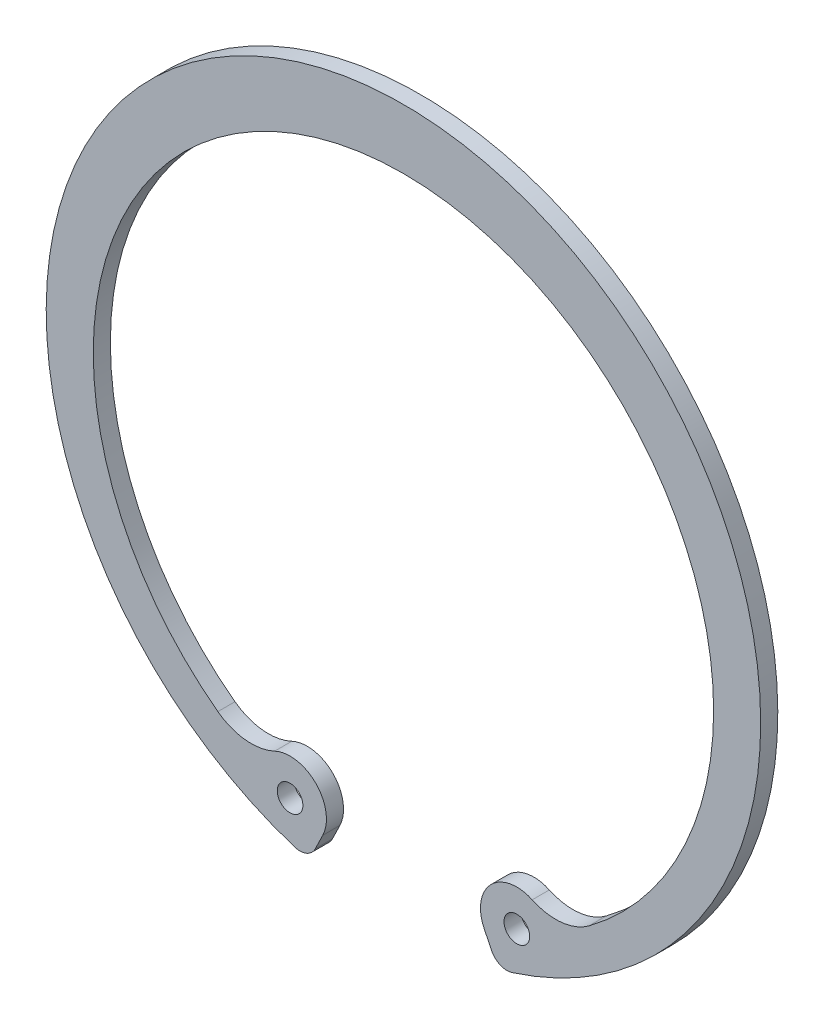
ISO-10303-21;
HEADER;
FILE_DESCRIPTION(('STEP AP214'),'2;1');
FILE_NAME('part.step','',(''),(''),'','','');
FILE_SCHEMA(('AUTOMOTIVE_DESIGN { 1 0 10303 214 1 1 1 1 }'));
ENDSEC;
DATA;
#1=APPLICATION_CONTEXT('core data for automotive mechanical design processes');
#2=APPLICATION_PROTOCOL_DEFINITION('international standard','automotive_design',2000,#1);
#3=PRODUCT_CONTEXT('',#1,'mechanical');
#4=PRODUCT('Part','Part','',(#3));
#5=PRODUCT_RELATED_PRODUCT_CATEGORY('part','',(#4));
#6=PRODUCT_DEFINITION_FORMATION('','',#4);
#7=PRODUCT_DEFINITION_CONTEXT('part definition',#1,'design');
#8=PRODUCT_DEFINITION('design','',#6,#7);
#9=PRODUCT_DEFINITION_SHAPE('','',#8);
#10=(LENGTH_UNIT() NAMED_UNIT(*) SI_UNIT(.MILLI.,.METRE.));
#11=(NAMED_UNIT(*) PLANE_ANGLE_UNIT() SI_UNIT($,.RADIAN.));
#12=(NAMED_UNIT(*) SI_UNIT($,.STERADIAN.) SOLID_ANGLE_UNIT());
#13=UNCERTAINTY_MEASURE_WITH_UNIT(LENGTH_MEASURE(1.E-05),#10,'distance_accuracy_value','');
#14=(GEOMETRIC_REPRESENTATION_CONTEXT(3) GLOBAL_UNCERTAINTY_ASSIGNED_CONTEXT((#13)) GLOBAL_UNIT_ASSIGNED_CONTEXT((#10,
#11,#12)) REPRESENTATION_CONTEXT('',''));
#15=CARTESIAN_POINT('',(0.,0.,0.));
#16=DIRECTION('',(0.,0.,1.));
#17=DIRECTION('',(1.,0.,0.));
#18=AXIS2_PLACEMENT_3D('',#15,#16,#17);
#19=CARTESIAN_POINT('',(-12.1004945718418,-37.8634458431457,2.));
#20=DIRECTION('',(0.,0.,1.));
#21=DIRECTION('',(1.,0.,0.));
#22=AXIS2_PLACEMENT_3D('',#19,#20,#21);
#23=PLANE('',#22);
#24=CARTESIAN_POINT('',(-13.25,-35.0811559102604,2.));
#25=DIRECTION('',(0.,0.,1.));
#26=DIRECTION('',(1.,0.,0.));
#27=AXIS2_PLACEMENT_3D('',#24,#25,#26);
#28=CIRCLE('',#27,1.5);
#29=CARTESIAN_POINT('',(-11.75,-35.0811559102604,2.));
#30=VERTEX_POINT('',#29);
#31=EDGE_CURVE('E167',#30,#30,#28,.T.);
#32=ORIENTED_EDGE('',*,*,#31,.F.);
#33=EDGE_LOOP('',(#32));
#34=FACE_BOUND('',#33,.T.);
#35=CARTESIAN_POINT('',(-12.1004945718418,-37.8634458431457,2.));
#36=DIRECTION('',(0.,0.,1.));
#37=DIRECTION('',(1.,0.,0.));
#38=AXIS2_PLACEMENT_3D('',#35,#36,#37);
#39=CIRCLE('',#38,2.);
#40=CARTESIAN_POINT('',(-12.7093244874062,-39.7685248792788,2.));
#41=VERTEX_POINT('',#40);
#42=CARTESIAN_POINT('',(-10.3016604578276,-38.7376287932534,2.));
#43=VERTEX_POINT('',#42);
#44=EDGE_CURVE('E191',#41,#43,#39,.T.);
#45=ORIENTED_EDGE('',*,*,#44,.T.);
#46=DIRECTION('',(0.437091475053842,0.899417057007069,0.));
#47=VECTOR('',#46,1.);
#48=CARTESIAN_POINT('',(-10.3016604578276,-38.7376287932534,2.));
#49=LINE('',#48,#47);
#50=CARTESIAN_POINT('',(-9.42747750771995,-36.9387946792392,2.));
#51=VERTEX_POINT('',#50);
#52=EDGE_CURVE('E114',#43,#51,#49,.T.);
#53=ORIENTED_EDGE('',*,*,#52,.T.);
#54=CARTESIAN_POINT('',(-13.25,-35.0811559102604,2.));
#55=DIRECTION('',(0.,0.,1.));
#56=DIRECTION('',(-1.,0.,0.));
#57=AXIS2_PLACEMENT_3D('',#54,#55,#56);
#58=CIRCLE('',#57,4.25);
#59=CARTESIAN_POINT('',(-15.0474924130677,-31.2299845267767,2.));
#60=VERTEX_POINT('',#59);
#61=EDGE_CURVE('E221',#51,#60,#58,.T.);
#62=ORIENTED_EDGE('',*,*,#61,.T.);
#63=CARTESIAN_POINT('',(-17.7965984565831,-25.3399577049781,2.));
#64=DIRECTION('',(0.,0.,-1.));
#65=DIRECTION('',(-1.,0.,0.));
#66=AXIS2_PLACEMENT_3D('',#63,#64,#65);
#67=CIRCLE('',#66,6.5);
#68=CARTESIAN_POINT('',(-21.6849308924752,-30.5486879598472,2.));
#69=VERTEX_POINT('',#68);
#70=EDGE_CURVE('E241',#60,#69,#67,.T.);
#71=ORIENTED_EDGE('',*,*,#70,.T.);
#72=CARTESIAN_POINT('',(0.,-1.49999999999999,2.));
#73=DIRECTION('',(0.,0.,-1.));
#74=DIRECTION('',(1.,0.,0.));
#75=AXIS2_PLACEMENT_3D('',#72,#73,#74);
#76=CIRCLE('',#75,36.25);
#77=CARTESIAN_POINT('',(21.6849308924752,-30.5486879598472,2.));
#78=VERTEX_POINT('',#77);
#79=EDGE_CURVE('E237',#69,#78,#76,.T.);
#80=ORIENTED_EDGE('',*,*,#79,.T.);
#81=CARTESIAN_POINT('',(17.7965984565831,-25.3399577049781,2.));
#82=DIRECTION('',(0.,0.,-1.));
#83=DIRECTION('',(1.,0.,0.));
#84=AXIS2_PLACEMENT_3D('',#81,#82,#83);
#85=CIRCLE('',#84,6.5);
#86=CARTESIAN_POINT('',(15.0474924130677,-31.2299845267767,2.));
#87=VERTEX_POINT('',#86);
#88=EDGE_CURVE('E240',#78,#87,#85,.T.);
#89=ORIENTED_EDGE('',*,*,#88,.T.);
#90=CARTESIAN_POINT('',(13.25,-35.0811559102604,2.));
#91=DIRECTION('',(0.,0.,1.));
#92=DIRECTION('',(1.,0.,0.));
#93=AXIS2_PLACEMENT_3D('',#90,#91,#92);
#94=CIRCLE('',#93,4.25);
#95=CARTESIAN_POINT('',(9.42747750771996,-36.9387946792392,2.));
#96=VERTEX_POINT('',#95);
#97=EDGE_CURVE('E139',#87,#96,#94,.T.);
#98=ORIENTED_EDGE('',*,*,#97,.T.);
#99=DIRECTION('',(0.437091475053842,-0.899417057007069,0.));
#100=VECTOR('',#99,1.);
#101=CARTESIAN_POINT('',(10.3016604578276,-38.7376287932534,2.));
#102=LINE('',#101,#100);
#103=CARTESIAN_POINT('',(10.3016604578276,-38.7376287932534,2.));
#104=VERTEX_POINT('',#103);
#105=EDGE_CURVE('E133',#96,#104,#102,.T.);
#106=ORIENTED_EDGE('',*,*,#105,.T.);
#107=CARTESIAN_POINT('',(12.1004945718418,-37.8634458431457,2.));
#108=DIRECTION('',(0.,0.,1.));
#109=DIRECTION('',(-1.,0.,0.));
#110=AXIS2_PLACEMENT_3D('',#107,#108,#109);
#111=CIRCLE('',#110,2.);
#112=CARTESIAN_POINT('',(12.7093244874062,-39.7685248792788,2.));
#113=VERTEX_POINT('',#112);
#114=EDGE_CURVE('E137',#104,#113,#111,.T.);
#115=ORIENTED_EDGE('',*,*,#114,.T.);
#116=CARTESIAN_POINT('',(0.,0.,2.));
#117=DIRECTION('',(0.,0.,1.));
#118=DIRECTION('',(1.,0.,0.));
#119=AXIS2_PLACEMENT_3D('',#116,#117,#118);
#120=CIRCLE('',#119,41.75);
#121=EDGE_CURVE('E65',#113,#41,#120,.T.);
#122=ORIENTED_EDGE('',*,*,#121,.T.);
#123=EDGE_LOOP('',(#45,#53,#62,#71,#80,#89,#98,#106,#115,#122));
#124=FACE_BOUND('',#123,.T.);
#125=CARTESIAN_POINT('',(13.25,-35.0811559102604,2.));
#126=DIRECTION('',(0.,0.,1.));
#127=DIRECTION('',(-1.,0.,0.));
#128=AXIS2_PLACEMENT_3D('',#125,#126,#127);
#129=CIRCLE('',#128,1.5);
#130=CARTESIAN_POINT('',(11.75,-35.0811559102604,2.));
#131=VERTEX_POINT('',#130);
#132=EDGE_CURVE('E263',#131,#131,#129,.T.);
#133=ORIENTED_EDGE('',*,*,#132,.F.);
#134=EDGE_LOOP('',(#133));
#135=FACE_BOUND('',#134,.T.);
#136=ADVANCED_FACE('F47',(#34,#124,#135),#23,.T.);
#137=CARTESIAN_POINT('',(-12.1004945718418,-37.8634458431457,0.));
#138=DIRECTION('',(0.,0.,1.));
#139=DIRECTION('',(1.,0.,0.));
#140=AXIS2_PLACEMENT_3D('',#137,#138,#139);
#141=PLANE('',#140);
#142=CARTESIAN_POINT('',(-12.1004945718418,-37.8634458431457,0.));
#143=DIRECTION('',(0.,0.,1.));
#144=DIRECTION('',(1.,0.,0.));
#145=AXIS2_PLACEMENT_3D('',#142,#143,#144);
#146=CIRCLE('',#145,2.);
#147=CARTESIAN_POINT('',(-12.7093244874062,-39.7685248792788,0.));
#148=VERTEX_POINT('',#147);
#149=CARTESIAN_POINT('',(-10.3016604578276,-38.7376287932534,0.));
#150=VERTEX_POINT('',#149);
#151=EDGE_CURVE('E162',#148,#150,#146,.T.);
#152=ORIENTED_EDGE('',*,*,#151,.F.);
#153=CARTESIAN_POINT('',(0.,0.,0.));
#154=DIRECTION('',(0.,0.,1.));
#155=DIRECTION('',(1.,0.,0.));
#156=AXIS2_PLACEMENT_3D('',#153,#154,#155);
#157=CIRCLE('',#156,41.75);
#158=CARTESIAN_POINT('',(12.7093244874062,-39.7685248792788,0.));
#159=VERTEX_POINT('',#158);
#160=EDGE_CURVE('E106',#159,#148,#157,.T.);
#161=ORIENTED_EDGE('',*,*,#160,.F.);
#162=CARTESIAN_POINT('',(12.1004945718418,-37.8634458431457,0.));
#163=DIRECTION('',(0.,0.,1.));
#164=DIRECTION('',(-1.,0.,0.));
#165=AXIS2_PLACEMENT_3D('',#162,#163,#164);
#166=CIRCLE('',#165,2.);
#167=CARTESIAN_POINT('',(10.3016604578276,-38.7376287932534,0.));
#168=VERTEX_POINT('',#167);
#169=EDGE_CURVE('E100',#168,#159,#166,.T.);
#170=ORIENTED_EDGE('',*,*,#169,.F.);
#171=DIRECTION('',(0.437091475053842,-0.899417057007069,0.));
#172=VECTOR('',#171,1.);
#173=CARTESIAN_POINT('',(10.3016604578276,-38.7376287932534,0.));
#174=LINE('',#173,#172);
#175=CARTESIAN_POINT('',(9.42747750771996,-36.9387946792392,0.));
#176=VERTEX_POINT('',#175);
#177=EDGE_CURVE('E148',#176,#168,#174,.T.);
#178=ORIENTED_EDGE('',*,*,#177,.F.);
#179=CARTESIAN_POINT('',(13.25,-35.0811559102604,0.));
#180=DIRECTION('',(0.,0.,1.));
#181=DIRECTION('',(1.,0.,0.));
#182=AXIS2_PLACEMENT_3D('',#179,#180,#181);
#183=CIRCLE('',#182,4.25);
#184=CARTESIAN_POINT('',(15.0474924130677,-31.2299845267767,0.));
#185=VERTEX_POINT('',#184);
#186=EDGE_CURVE('E182',#185,#176,#183,.T.);
#187=ORIENTED_EDGE('',*,*,#186,.F.);
#188=CARTESIAN_POINT('',(17.7965984565831,-25.3399577049781,0.));
#189=DIRECTION('',(0.,0.,-1.));
#190=DIRECTION('',(1.,0.,0.));
#191=AXIS2_PLACEMENT_3D('',#188,#189,#190);
#192=CIRCLE('',#191,6.5);
#193=CARTESIAN_POINT('',(21.6849308924752,-30.5486879598472,0.));
#194=VERTEX_POINT('',#193);
#195=EDGE_CURVE('E179',#194,#185,#192,.T.);
#196=ORIENTED_EDGE('',*,*,#195,.F.);
#197=CARTESIAN_POINT('',(0.,-1.49999999999999,0.));
#198=DIRECTION('',(0.,0.,-1.));
#199=DIRECTION('',(1.,0.,0.));
#200=AXIS2_PLACEMENT_3D('',#197,#198,#199);
#201=CIRCLE('',#200,36.25);
#202=CARTESIAN_POINT('',(-21.6849308924752,-30.5486879598472,0.));
#203=VERTEX_POINT('',#202);
#204=EDGE_CURVE('E176',#203,#194,#201,.T.);
#205=ORIENTED_EDGE('',*,*,#204,.F.);
#206=CARTESIAN_POINT('',(-17.7965984565831,-25.3399577049781,0.));
#207=DIRECTION('',(0.,0.,-1.));
#208=DIRECTION('',(-1.,0.,0.));
#209=AXIS2_PLACEMENT_3D('',#206,#207,#208);
#210=CIRCLE('',#209,6.5);
#211=CARTESIAN_POINT('',(-15.0474924130677,-31.2299845267767,0.));
#212=VERTEX_POINT('',#211);
#213=EDGE_CURVE('E173',#212,#203,#210,.T.);
#214=ORIENTED_EDGE('',*,*,#213,.F.);
#215=CARTESIAN_POINT('',(-13.25,-35.0811559102604,0.));
#216=DIRECTION('',(0.,0.,1.));
#217=DIRECTION('',(-1.,0.,0.));
#218=AXIS2_PLACEMENT_3D('',#215,#216,#217);
#219=CIRCLE('',#218,4.25);
#220=CARTESIAN_POINT('',(-9.42747750771995,-36.9387946792392,0.));
#221=VERTEX_POINT('',#220);
#222=EDGE_CURVE('E170',#221,#212,#219,.T.);
#223=ORIENTED_EDGE('',*,*,#222,.F.);
#224=DIRECTION('',(0.437091475053842,0.899417057007069,0.));
#225=VECTOR('',#224,1.);
#226=CARTESIAN_POINT('',(-10.3016604578276,-38.7376287932534,0.));
#227=LINE('',#226,#225);
#228=EDGE_CURVE('E166',#150,#221,#227,.T.);
#229=ORIENTED_EDGE('',*,*,#228,.F.);
#230=EDGE_LOOP('',(#152,#161,#170,#178,#187,#196,#205,#214,#223,#229));
#231=FACE_BOUND('',#230,.T.);
#232=CARTESIAN_POINT('',(-13.25,-35.0811559102604,0.));
#233=DIRECTION('',(0.,0.,1.));
#234=DIRECTION('',(1.,0.,0.));
#235=AXIS2_PLACEMENT_3D('',#232,#233,#234);
#236=CIRCLE('',#235,1.5);
#237=CARTESIAN_POINT('',(-11.75,-35.0811559102604,0.));
#238=VERTEX_POINT('',#237);
#239=EDGE_CURVE('E259',#238,#238,#236,.T.);
#240=ORIENTED_EDGE('',*,*,#239,.T.);
#241=EDGE_LOOP('',(#240));
#242=FACE_BOUND('',#241,.T.);
#243=CARTESIAN_POINT('',(13.25,-35.0811559102604,0.));
#244=DIRECTION('',(0.,0.,1.));
#245=DIRECTION('',(-1.,0.,0.));
#246=AXIS2_PLACEMENT_3D('',#243,#244,#245);
#247=CIRCLE('',#246,1.5);
#248=CARTESIAN_POINT('',(11.75,-35.0811559102604,0.));
#249=VERTEX_POINT('',#248);
#250=EDGE_CURVE('E267',#249,#249,#247,.T.);
#251=ORIENTED_EDGE('',*,*,#250,.T.);
#252=EDGE_LOOP('',(#251));
#253=FACE_BOUND('',#252,.T.);
#254=ADVANCED_FACE('F225',(#231,#242,#253),#141,.F.);
#255=CARTESIAN_POINT('',(-12.1004945718418,-37.8634458431457,2.));
#256=DIRECTION('',(0.,0.,-1.));
#257=DIRECTION('',(-1.,0.,0.));
#258=AXIS2_PLACEMENT_3D('',#255,#256,#257);
#259=CYLINDRICAL_SURFACE('',#258,2.);
#260=ORIENTED_EDGE('',*,*,#151,.T.);
#261=DIRECTION('',(0.,0.,-1.));
#262=VECTOR('',#261,1.);
#263=CARTESIAN_POINT('',(-10.3016604578276,-38.7376287932534,2.));
#264=LINE('',#263,#262);
#265=EDGE_CURVE('E11',#43,#150,#264,.T.);
#266=ORIENTED_EDGE('',*,*,#265,.F.);
#267=ORIENTED_EDGE('',*,*,#44,.F.);
#268=DIRECTION('',(0.,0.,-1.));
#269=VECTOR('',#268,1.);
#270=CARTESIAN_POINT('',(-12.7093244874062,-39.7685248792788,2.));
#271=LINE('',#270,#269);
#272=EDGE_CURVE('E158',#41,#148,#271,.T.);
#273=ORIENTED_EDGE('',*,*,#272,.T.);
#274=EDGE_LOOP('',(#260,#266,#267,#273));
#275=FACE_BOUND('',#274,.T.);
#276=ADVANCED_FACE('F49',(#275),#259,.T.);
#277=CARTESIAN_POINT('',(-10.3016604578276,-38.7376287932534,2.));
#278=DIRECTION('',(-0.899417057007069,0.437091475053842,0.));
#279=DIRECTION('',(-0.437091475053842,-0.899417057007069,0.));
#280=AXIS2_PLACEMENT_3D('',#277,#278,#279);
#281=PLANE('',#280);
#282=ORIENTED_EDGE('',*,*,#228,.T.);
#283=DIRECTION('',(0.,0.,-1.));
#284=VECTOR('',#283,1.);
#285=CARTESIAN_POINT('',(-9.42747750771995,-36.9387946792392,2.));
#286=LINE('',#285,#284);
#287=EDGE_CURVE('E57',#51,#221,#286,.T.);
#288=ORIENTED_EDGE('',*,*,#287,.F.);
#289=ORIENTED_EDGE('',*,*,#52,.F.);
#290=ORIENTED_EDGE('',*,*,#265,.T.);
#291=EDGE_LOOP('',(#282,#288,#289,#290));
#292=FACE_BOUND('',#291,.T.);
#293=ADVANCED_FACE('F310',(#292),#281,.F.);
#294=CARTESIAN_POINT('',(-13.25,-35.0811559102604,2.));
#295=DIRECTION('',(0.,0.,-1.));
#296=DIRECTION('',(-1.,0.,0.));
#297=AXIS2_PLACEMENT_3D('',#294,#295,#296);
#298=CYLINDRICAL_SURFACE('',#297,4.25);
#299=ORIENTED_EDGE('',*,*,#222,.T.);
#300=DIRECTION('',(0.,0.,-1.));
#301=VECTOR('',#300,1.);
#302=CARTESIAN_POINT('',(-15.0474924130677,-31.2299845267767,2.));
#303=LINE('',#302,#301);
#304=EDGE_CURVE('E210',#60,#212,#303,.T.);
#305=ORIENTED_EDGE('',*,*,#304,.F.);
#306=ORIENTED_EDGE('',*,*,#61,.F.);
#307=ORIENTED_EDGE('',*,*,#287,.T.);
#308=EDGE_LOOP('',(#299,#305,#306,#307));
#309=FACE_BOUND('',#308,.T.);
#310=ADVANCED_FACE('F219',(#309),#298,.T.);
#311=CARTESIAN_POINT('',(-17.7965984565831,-25.3399577049781,2.));
#312=DIRECTION('',(0.,0.,-1.));
#313=DIRECTION('',(-1.,0.,0.));
#314=AXIS2_PLACEMENT_3D('',#311,#312,#313);
#315=CYLINDRICAL_SURFACE('',#314,6.5);
#316=ORIENTED_EDGE('',*,*,#213,.T.);
#317=DIRECTION('',(0.,0.,-1.));
#318=VECTOR('',#317,1.);
#319=CARTESIAN_POINT('',(-21.6849308924752,-30.5486879598472,2.));
#320=LINE('',#319,#318);
#321=EDGE_CURVE('E206',#69,#203,#320,.T.);
#322=ORIENTED_EDGE('',*,*,#321,.F.);
#323=ORIENTED_EDGE('',*,*,#70,.F.);
#324=ORIENTED_EDGE('',*,*,#304,.T.);
#325=EDGE_LOOP('',(#316,#322,#323,#324));
#326=FACE_BOUND('',#325,.T.);
#327=ADVANCED_FACE('F231',(#326),#315,.F.);
#328=CARTESIAN_POINT('',(0.,-1.49999999999999,2.));
#329=DIRECTION('',(0.,0.,-1.));
#330=DIRECTION('',(-1.,0.,0.));
#331=AXIS2_PLACEMENT_3D('',#328,#329,#330);
#332=CYLINDRICAL_SURFACE('',#331,36.25);
#333=ORIENTED_EDGE('',*,*,#204,.T.);
#334=DIRECTION('',(0.,0.,-1.));
#335=VECTOR('',#334,1.);
#336=CARTESIAN_POINT('',(21.6849308924752,-30.5486879598472,2.));
#337=LINE('',#336,#335);
#338=EDGE_CURVE('E202',#78,#194,#337,.T.);
#339=ORIENTED_EDGE('',*,*,#338,.F.);
#340=ORIENTED_EDGE('',*,*,#79,.F.);
#341=ORIENTED_EDGE('',*,*,#321,.T.);
#342=EDGE_LOOP('',(#333,#339,#340,#341));
#343=FACE_BOUND('',#342,.T.);
#344=ADVANCED_FACE('F235',(#343),#332,.F.);
#345=CARTESIAN_POINT('',(17.7965984565831,-25.3399577049781,2.));
#346=DIRECTION('',(0.,0.,-1.));
#347=DIRECTION('',(-1.,0.,0.));
#348=AXIS2_PLACEMENT_3D('',#345,#346,#347);
#349=CYLINDRICAL_SURFACE('',#348,6.5);
#350=ORIENTED_EDGE('',*,*,#195,.T.);
#351=DIRECTION('',(0.,0.,-1.));
#352=VECTOR('',#351,1.);
#353=CARTESIAN_POINT('',(15.0474924130677,-31.2299845267767,2.));
#354=LINE('',#353,#352);
#355=EDGE_CURVE('E198',#87,#185,#354,.T.);
#356=ORIENTED_EDGE('',*,*,#355,.F.);
#357=ORIENTED_EDGE('',*,*,#88,.F.);
#358=ORIENTED_EDGE('',*,*,#338,.T.);
#359=EDGE_LOOP('',(#350,#356,#357,#358));
#360=FACE_BOUND('',#359,.T.);
#361=ADVANCED_FACE('F300',(#360),#349,.F.);
#362=CARTESIAN_POINT('',(13.25,-35.0811559102604,2.));
#363=DIRECTION('',(0.,0.,-1.));
#364=DIRECTION('',(-1.,0.,0.));
#365=AXIS2_PLACEMENT_3D('',#362,#363,#364);
#366=CYLINDRICAL_SURFACE('',#365,4.25);
#367=ORIENTED_EDGE('',*,*,#186,.T.);
#368=DIRECTION('',(0.,0.,-1.));
#369=VECTOR('',#368,1.);
#370=CARTESIAN_POINT('',(9.42747750771996,-36.9387946792392,2.));
#371=LINE('',#370,#369);
#372=EDGE_CURVE('E150',#96,#176,#371,.T.);
#373=ORIENTED_EDGE('',*,*,#372,.F.);
#374=ORIENTED_EDGE('',*,*,#97,.F.);
#375=ORIENTED_EDGE('',*,*,#355,.T.);
#376=EDGE_LOOP('',(#367,#373,#374,#375));
#377=FACE_BOUND('',#376,.T.);
#378=ADVANCED_FACE('F297',(#377),#366,.T.);
#379=CARTESIAN_POINT('',(10.3016604578276,-38.7376287932534,2.));
#380=DIRECTION('',(0.899417057007069,0.437091475053842,0.));
#381=DIRECTION('',(-0.437091475053842,0.899417057007069,0.));
#382=AXIS2_PLACEMENT_3D('',#379,#380,#381);
#383=PLANE('',#382);
#384=ORIENTED_EDGE('',*,*,#177,.T.);
#385=DIRECTION('',(0.,0.,-1.));
#386=VECTOR('',#385,1.);
#387=CARTESIAN_POINT('',(10.3016604578276,-38.7376287932534,2.));
#388=LINE('',#387,#386);
#389=EDGE_CURVE('E145',#104,#168,#388,.T.);
#390=ORIENTED_EDGE('',*,*,#389,.F.);
#391=ORIENTED_EDGE('',*,*,#105,.F.);
#392=ORIENTED_EDGE('',*,*,#372,.T.);
#393=EDGE_LOOP('',(#384,#390,#391,#392));
#394=FACE_BOUND('',#393,.T.);
#395=ADVANCED_FACE('F146',(#394),#383,.F.);
#396=CARTESIAN_POINT('',(12.1004945718418,-37.8634458431457,2.));
#397=DIRECTION('',(0.,0.,-1.));
#398=DIRECTION('',(-1.,0.,0.));
#399=AXIS2_PLACEMENT_3D('',#396,#397,#398);
#400=CYLINDRICAL_SURFACE('',#399,2.);
#401=ORIENTED_EDGE('',*,*,#169,.T.);
#402=DIRECTION('',(0.,0.,-1.));
#403=VECTOR('',#402,1.);
#404=CARTESIAN_POINT('',(12.7093244874062,-39.7685248792788,2.));
#405=LINE('',#404,#403);
#406=EDGE_CURVE('E151',#113,#159,#405,.T.);
#407=ORIENTED_EDGE('',*,*,#406,.F.);
#408=ORIENTED_EDGE('',*,*,#114,.F.);
#409=ORIENTED_EDGE('',*,*,#389,.T.);
#410=EDGE_LOOP('',(#401,#407,#408,#409));
#411=FACE_BOUND('',#410,.T.);
#412=ADVANCED_FACE('F153',(#411),#400,.T.);
#413=CARTESIAN_POINT('',(0.,0.,2.));
#414=DIRECTION('',(0.,0.,-1.));
#415=DIRECTION('',(-1.,0.,0.));
#416=AXIS2_PLACEMENT_3D('',#413,#414,#415);
#417=CYLINDRICAL_SURFACE('',#416,41.75);
#418=ORIENTED_EDGE('',*,*,#160,.T.);
#419=ORIENTED_EDGE('',*,*,#272,.F.);
#420=ORIENTED_EDGE('',*,*,#121,.F.);
#421=ORIENTED_EDGE('',*,*,#406,.T.);
#422=EDGE_LOOP('',(#418,#419,#420,#421));
#423=FACE_BOUND('',#422,.T.);
#424=ADVANCED_FACE('F290',(#423),#417,.T.);
#425=CARTESIAN_POINT('',(-13.25,-35.0811559102604,2.));
#426=DIRECTION('',(0.,0.,-1.));
#427=DIRECTION('',(-1.,0.,0.));
#428=AXIS2_PLACEMENT_3D('',#425,#426,#427);
#429=CYLINDRICAL_SURFACE('',#428,1.5);
#430=ORIENTED_EDGE('',*,*,#31,.T.);
#431=EDGE_LOOP('',(#430));
#432=FACE_BOUND('',#431,.T.);
#433=ORIENTED_EDGE('',*,*,#239,.F.);
#434=EDGE_LOOP('',(#433));
#435=FACE_BOUND('',#434,.T.);
#436=ADVANCED_FACE('F287',(#432,#435),#429,.F.);
#437=CARTESIAN_POINT('',(13.25,-35.0811559102604,2.));
#438=DIRECTION('',(0.,0.,-1.));
#439=DIRECTION('',(-1.,0.,0.));
#440=AXIS2_PLACEMENT_3D('',#437,#438,#439);
#441=CYLINDRICAL_SURFACE('',#440,1.5);
#442=ORIENTED_EDGE('',*,*,#132,.T.);
#443=EDGE_LOOP('',(#442));
#444=FACE_BOUND('',#443,.T.);
#445=ORIENTED_EDGE('',*,*,#250,.F.);
#446=EDGE_LOOP('',(#445));
#447=FACE_BOUND('',#446,.T.);
#448=ADVANCED_FACE('F276',(#444,#447),#441,.F.);
#449=CLOSED_SHELL('',(#136,#254,#276,#293,#310,#327,#344,#361,#378,#395,#412,#424,#436,#448));
#450=MANIFOLD_SOLID_BREP('B2',#449);
#451=ADVANCED_BREP_SHAPE_REPRESENTATION('',(#18,#450),#14);
#452=SHAPE_DEFINITION_REPRESENTATION(#9,#451);
ENDSEC;
END-ISO-10303-21;
